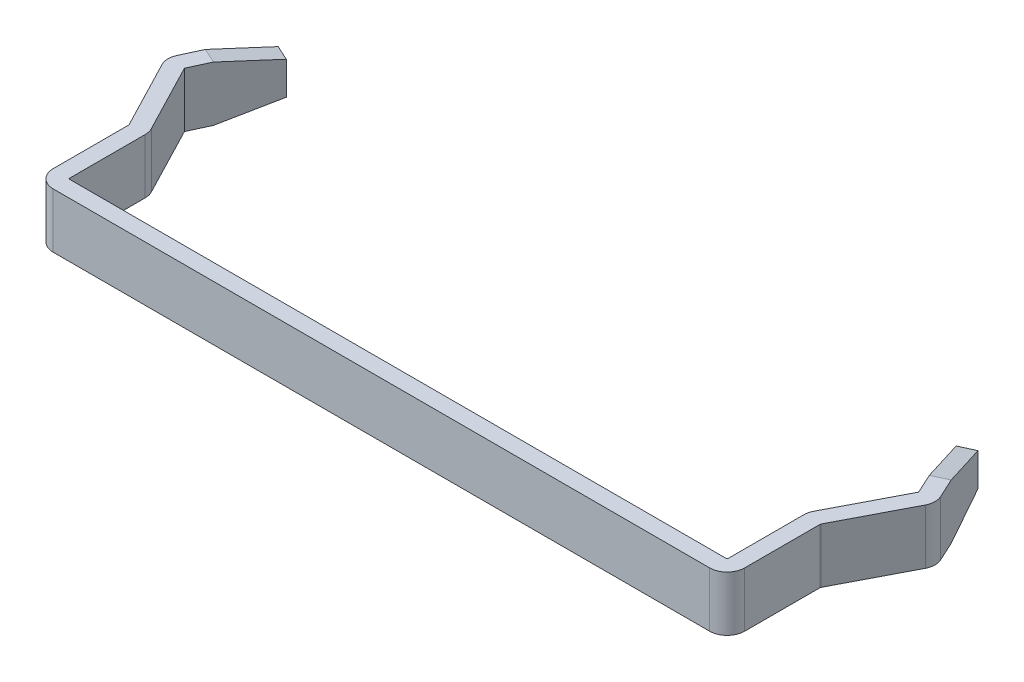
ISO-10303-21;
HEADER;
FILE_DESCRIPTION(('STEP AP214'),'2;1');
FILE_NAME('part.step','',(''),(''),'','','');
FILE_SCHEMA(('AUTOMOTIVE_DESIGN { 1 0 10303 214 1 1 1 1 }'));
ENDSEC;
DATA;
#1=APPLICATION_CONTEXT('core data for automotive mechanical design processes');
#2=APPLICATION_PROTOCOL_DEFINITION('international standard','automotive_design',2000,#1);
#3=PRODUCT_CONTEXT('',#1,'mechanical');
#4=PRODUCT('Part','Part','',(#3));
#5=PRODUCT_RELATED_PRODUCT_CATEGORY('part','',(#4));
#6=PRODUCT_DEFINITION_FORMATION('','',#4);
#7=PRODUCT_DEFINITION_CONTEXT('part definition',#1,'design');
#8=PRODUCT_DEFINITION('design','',#6,#7);
#9=PRODUCT_DEFINITION_SHAPE('','',#8);
#10=(LENGTH_UNIT() NAMED_UNIT(*) SI_UNIT(.MILLI.,.METRE.));
#11=(NAMED_UNIT(*) PLANE_ANGLE_UNIT() SI_UNIT($,.RADIAN.));
#12=(NAMED_UNIT(*) SI_UNIT($,.STERADIAN.) SOLID_ANGLE_UNIT());
#13=UNCERTAINTY_MEASURE_WITH_UNIT(LENGTH_MEASURE(1.E-05),#10,'distance_accuracy_value','');
#14=(GEOMETRIC_REPRESENTATION_CONTEXT(3) GLOBAL_UNCERTAINTY_ASSIGNED_CONTEXT((#13)) GLOBAL_UNIT_ASSIGNED_CONTEXT((#10,
#11,#12)) REPRESENTATION_CONTEXT('',''));
#15=CARTESIAN_POINT('',(0.,0.,0.));
#16=DIRECTION('',(0.,0.,1.));
#17=DIRECTION('',(1.,0.,0.));
#18=AXIS2_PLACEMENT_3D('',#15,#16,#17);
#19=CARTESIAN_POINT('',(6.239242818792,2.5,-3.432167207178));
#20=DIRECTION('',(0.419114229203929,0.,0.907933512366845));
#21=DIRECTION('',(0.907933512366845,0.,-0.419114229203929));
#22=AXIS2_PLACEMENT_3D('',#19,#20,#21);
#23=PLANE('',#22);
#24=DIRECTION('',(0.907933512367032,1.02637805662003E-13,-0.419114229203525));
#25=VECTOR('',#24,1.);
#26=CARTESIAN_POINT('',(6.103052791937,2.80000000000007,-3.36930007279701));
#27=LINE('',#26,#25);
#28=CARTESIAN_POINT('',(6.103052791937,2.80000000000007,-3.36930007279701));
#29=VERTEX_POINT('',#28);
#30=CARTESIAN_POINT('',(6.375432845647,2.80000000000003,-3.49503434155801));
#31=VERTEX_POINT('',#30);
#32=EDGE_CURVE('E248',#29,#31,#27,.T.);
#33=ORIENTED_EDGE('',*,*,#32,.T.);
#34=DIRECTION('',(0.,1.,0.));
#35=VECTOR('',#34,1.);
#36=CARTESIAN_POINT('',(6.375432845647,2.,-3.495034341558));
#37=LINE('',#36,#35);
#38=CARTESIAN_POINT('',(6.375432845647,2.19999999999997,-3.49503434155801));
#39=VERTEX_POINT('',#38);
#40=EDGE_CURVE('E235',#31,#39,#37,.F.);
#41=ORIENTED_EDGE('',*,*,#40,.T.);
#42=DIRECTION('',(-0.907933512367032,1.02637805662003E-13,0.419114229203525));
#43=VECTOR('',#42,1.);
#44=CARTESIAN_POINT('',(6.37543284564699,2.1999999999999,-3.49503434155802));
#45=LINE('',#44,#43);
#46=CARTESIAN_POINT('',(6.103052791937,2.19999999999998,-3.369300072797));
#47=VERTEX_POINT('',#46);
#48=EDGE_CURVE('E230',#39,#47,#45,.T.);
#49=ORIENTED_EDGE('',*,*,#48,.T.);
#50=DIRECTION('',(0.,1.,0.));
#51=VECTOR('',#50,1.);
#52=CARTESIAN_POINT('',(6.103052791937,3.,-3.369300072797));
#53=LINE('',#52,#51);
#54=EDGE_CURVE('E232',#47,#29,#53,.T.);
#55=ORIENTED_EDGE('',*,*,#54,.T.);
#56=EDGE_LOOP('',(#33,#41,#49,#55));
#57=FACE_BOUND('',#56,.T.);
#58=ADVANCED_FACE('F17',(#57),#23,.F.);
#59=CARTESIAN_POINT('',(-6.239242818792,2.5,-3.432167207178));
#60=DIRECTION('',(0.419114229203929,0.,-0.907933512366845));
#61=DIRECTION('',(-0.907933512366845,0.,-0.419114229203929));
#62=AXIS2_PLACEMENT_3D('',#59,#60,#61);
#63=PLANE('',#62);
#64=DIRECTION('',(0.,1.,0.));
#65=VECTOR('',#64,1.);
#66=CARTESIAN_POINT('',(-6.10305279193781,3.,-3.36930007279737));
#67=LINE('',#66,#65);
#68=CARTESIAN_POINT('',(-6.10305279193785,2.79999999999959,-3.3693000727973));
#69=VERTEX_POINT('',#68);
#70=CARTESIAN_POINT('',(-6.10305279193785,2.20000000000044,-3.3693000727973));
#71=VERTEX_POINT('',#70);
#72=EDGE_CURVE('E279',#69,#71,#67,.F.);
#73=ORIENTED_EDGE('',*,*,#72,.T.);
#74=DIRECTION('',(0.907933512367031,1.02637805662004E-13,0.419114229203526));
#75=VECTOR('',#74,1.);
#76=CARTESIAN_POINT('',(-6.37543284564711,2.20000000000128,-3.49503434155777));
#77=LINE('',#76,#75);
#78=CARTESIAN_POINT('',(-6.37543284564783,2.20000000000043,-3.49503434155829));
#79=VERTEX_POINT('',#78);
#80=EDGE_CURVE('E239',#79,#71,#77,.T.);
#81=ORIENTED_EDGE('',*,*,#80,.F.);
#82=DIRECTION('',(0.,1.,0.));
#83=VECTOR('',#82,1.);
#84=CARTESIAN_POINT('',(-6.37543284564819,2.,-3.49503434155855));
#85=LINE('',#84,#83);
#86=CARTESIAN_POINT('',(-6.37543284564747,2.7999999999988,-3.49503434155804));
#87=VERTEX_POINT('',#86);
#88=EDGE_CURVE('E276',#79,#87,#85,.T.);
#89=ORIENTED_EDGE('',*,*,#88,.T.);
#90=DIRECTION('',(-0.907933512367032,1.04083408558651E-13,-0.419114229203524));
#91=VECTOR('',#90,1.);
#92=CARTESIAN_POINT('',(-6.10305279193711,2.79999999999877,-3.36930007279678));
#93=LINE('',#92,#91);
#94=EDGE_CURVE('E197',#69,#87,#93,.T.);
#95=ORIENTED_EDGE('',*,*,#94,.F.);
#96=EDGE_LOOP('',(#73,#81,#89,#95));
#97=FACE_BOUND('',#96,.T.);
#98=ADVANCED_FACE('F572',(#97),#63,.T.);
#99=CARTESIAN_POINT('',(6.239242818792,2.2,-3.432167207178));
#100=DIRECTION('',(0.0821950628129803,0.980580675690884,0.178060411407979));
#101=DIRECTION('',(0.,-0.178664967028473,0.983909970249674));
#102=AXIS2_PLACEMENT_3D('',#99,#100,#101);
#103=PLANE('',#102);
#104=DIRECTION('',(-0.907933512365772,0.,0.419114229206253));
#105=VECTOR('',#104,1.);
#106=CARTESIAN_POINT('',(6.794547074852,2.,-2.587100829192));
#107=LINE('',#106,#105);
#108=CARTESIAN_POINT('',(6.7945470748516,2.,-2.58710082919181));
#109=VERTEX_POINT('',#108);
#110=CARTESIAN_POINT('',(6.52216702114173,2.,-2.46136656042987));
#111=VERTEX_POINT('',#110);
#112=EDGE_CURVE('E253',#109,#111,#107,.T.);
#113=ORIENTED_EDGE('',*,*,#112,.T.);
#114=DIRECTION('',(-0.410975314064477,0.196116135138073,-0.890302057039132));
#115=VECTOR('',#114,1.);
#116=CARTESIAN_POINT('',(6.52216702114118,2.,-2.46136656042962));
#117=LINE('',#116,#115);
#118=EDGE_CURVE('E244',#111,#47,#117,.T.);
#119=ORIENTED_EDGE('',*,*,#118,.T.);
#120=ORIENTED_EDGE('',*,*,#48,.F.);
#121=DIRECTION('',(0.410975314064463,-0.196116135138244,0.890302057039101));
#122=VECTOR('',#121,1.);
#123=CARTESIAN_POINT('',(6.375432845647,2.2,-3.495034341558));
#124=LINE('',#123,#122);
#125=EDGE_CURVE('E269',#39,#109,#124,.T.);
#126=ORIENTED_EDGE('',*,*,#125,.T.);
#127=EDGE_LOOP('',(#113,#119,#120,#126));
#128=FACE_BOUND('',#127,.T.);
#129=ADVANCED_FACE('F251',(#128),#103,.F.);
#130=CARTESIAN_POINT('',(3.539853882907,2.,2.183396605594));
#131=DIRECTION('',(0.0821950628129803,-0.980580675690884,-0.178060411407979));
#132=DIRECTION('',(0.,0.178664967028473,-0.983909970249674));
#133=AXIS2_PLACEMENT_3D('',#130,#131,#132);
#134=PLANE('',#133);
#135=DIRECTION('',(-0.410975314064477,-0.196116135138073,0.890302057039132));
#136=VECTOR('',#135,1.);
#137=CARTESIAN_POINT('',(-6.10305279193781,2.2,-3.36930007279737));
#138=LINE('',#137,#136);
#139=CARTESIAN_POINT('',(-6.522167021142,1.99999999999999,-2.46136656043));
#140=VERTEX_POINT('',#139);
#141=EDGE_CURVE('E410',#71,#140,#138,.T.);
#142=ORIENTED_EDGE('',*,*,#141,.T.);
#143=DIRECTION('',(-0.907933512365773,0.,-0.419114229206252));
#144=VECTOR('',#143,1.);
#145=CARTESIAN_POINT('',(-6.522167021142,1.99999999999998,-2.46136656043));
#146=LINE('',#145,#144);
#147=CARTESIAN_POINT('',(-6.794547074852,1.99999999999999,-2.587100829192));
#148=VERTEX_POINT('',#147);
#149=EDGE_CURVE('E473',#140,#148,#146,.T.);
#150=ORIENTED_EDGE('',*,*,#149,.T.);
#151=DIRECTION('',(0.410975314064462,0.196116135138244,-0.890302057039101));
#152=VECTOR('',#151,1.);
#153=CARTESIAN_POINT('',(-6.79454707485199,2.,-2.58710082919199));
#154=LINE('',#153,#152);
#155=EDGE_CURVE('E290',#148,#79,#154,.T.);
#156=ORIENTED_EDGE('',*,*,#155,.T.);
#157=ORIENTED_EDGE('',*,*,#80,.T.);
#158=EDGE_LOOP('',(#142,#150,#156,#157));
#159=FACE_BOUND('',#158,.T.);
#160=ADVANCED_FACE('F481',(#159),#134,.T.);
#161=CARTESIAN_POINT('',(-6.68,0.,-2.1));
#162=DIRECTION('',(0.,1.,0.));
#163=DIRECTION('',(0.,0.,1.));
#164=AXIS2_PLACEMENT_3D('',#161,#162,#163);
#165=CYLINDRICAL_SURFACE('',#164,0.008152016572859);
#166=CARTESIAN_POINT('',(-6.68,3.,-2.1));
#167=DIRECTION('',(0.,1.,0.));
#168=DIRECTION('',(0.,0.,1.));
#169=AXIS2_PLACEMENT_3D('',#166,#167,#168);
#170=CIRCLE('',#169,0.008152016572859);
#171=CARTESIAN_POINT('',(-6.68740148903991,2.99999999999999,-2.10341662614219));
#172=VERTEX_POINT('',#171);
#173=CARTESIAN_POINT('',(-6.687234125005,3.,-2.09624196732115));
#174=VERTEX_POINT('',#173);
#175=EDGE_CURVE('E352',#172,#174,#170,.T.);
#176=ORIENTED_EDGE('',*,*,#175,.T.);
#177=DIRECTION('',(0.,1.,0.));
#178=VECTOR('',#177,1.);
#179=CARTESIAN_POINT('',(-6.68723412500487,3.,-2.09624196732107));
#180=LINE('',#179,#178);
#181=CARTESIAN_POINT('',(-6.687234125005,2.,-2.09624196732115));
#182=VERTEX_POINT('',#181);
#183=EDGE_CURVE('E286',#174,#182,#180,.F.);
#184=ORIENTED_EDGE('',*,*,#183,.T.);
#185=CARTESIAN_POINT('',(-6.68,2.,-2.1));
#186=DIRECTION('',(0.,1.,0.));
#187=DIRECTION('',(0.,0.,1.));
#188=AXIS2_PLACEMENT_3D('',#185,#186,#187);
#189=CIRCLE('',#188,0.008152016572859);
#190=CARTESIAN_POINT('',(-6.68740148903991,1.99999999999999,-2.10341662614219));
#191=VERTEX_POINT('',#190);
#192=EDGE_CURVE('E360',#182,#191,#189,.F.);
#193=ORIENTED_EDGE('',*,*,#192,.T.);
#194=DIRECTION('',(0.,1.,0.));
#195=VECTOR('',#194,1.);
#196=CARTESIAN_POINT('',(-6.68740148904,3.,-2.103416626142));
#197=LINE('',#196,#195);
#198=EDGE_CURVE('E407',#191,#172,#197,.T.);
#199=ORIENTED_EDGE('',*,*,#198,.T.);
#200=EDGE_LOOP('',(#176,#184,#193,#199));
#201=FACE_BOUND('',#200,.T.);
#202=ADVANCED_FACE('F586',(#201),#165,.F.);
#203=CARTESIAN_POINT('',(-6.036030999085,3.,-0.842691181759));
#204=DIRECTION('',(-0.887403127858645,0.,0.460994239298816));
#205=DIRECTION('',(0.460994239298816,0.,0.887403127858645));
#206=AXIS2_PLACEMENT_3D('',#203,#204,#205);
#207=PLANE('',#206);
#208=DIRECTION('',(0.460994239298908,0.,0.887403127858597));
#209=VECTOR('',#208,1.);
#210=CARTESIAN_POINT('',(-6.687234125005,2.99999999999998,-2.096241967321));
#211=LINE('',#210,#209);
#212=CARTESIAN_POINT('',(-6.03603099908518,3.,-0.842691181759056));
#213=VERTEX_POINT('',#212);
#214=EDGE_CURVE('E351',#174,#213,#211,.T.);
#215=ORIENTED_EDGE('',*,*,#214,.T.);
#216=DIRECTION('',(0.,-1.,0.));
#217=VECTOR('',#216,1.);
#218=CARTESIAN_POINT('',(-6.03603099908524,0.,-0.842691181758876));
#219=LINE('',#218,#217);
#220=CARTESIAN_POINT('',(-6.03603099908518,2.,-0.842691181759056));
#221=VERTEX_POINT('',#220);
#222=EDGE_CURVE('E464',#221,#213,#219,.F.);
#223=ORIENTED_EDGE('',*,*,#222,.F.);
#224=DIRECTION('',(-0.460994239298909,0.,-0.887403127858596));
#225=VECTOR('',#224,1.);
#226=CARTESIAN_POINT('',(-6.036030999085,1.99999999999998,-0.842691181759));
#227=LINE('',#226,#225);
#228=EDGE_CURVE('E364',#221,#182,#227,.T.);
#229=ORIENTED_EDGE('',*,*,#228,.T.);
#230=ORIENTED_EDGE('',*,*,#183,.F.);
#231=EDGE_LOOP('',(#215,#223,#229,#230));
#232=FACE_BOUND('',#231,.T.);
#233=ADVANCED_FACE('F590',(#232),#207,.F.);
#234=CARTESIAN_POINT('',(-6.320000000001,0.,-0.695173025183));
#235=DIRECTION('',(0.,-1.,0.));
#236=DIRECTION('',(0.,0.,-1.));
#237=AXIS2_PLACEMENT_3D('',#234,#235,#236);
#238=CYLINDRICAL_SURFACE('',#237,0.320000000001);
#239=DIRECTION('',(0.,1.,0.));
#240=VECTOR('',#239,1.);
#241=CARTESIAN_POINT('',(-6.,3.,-0.695173025183));
#242=LINE('',#241,#240);
#243=CARTESIAN_POINT('',(-6.,2.99999999999999,-0.695173025183));
#244=VERTEX_POINT('',#243);
#245=CARTESIAN_POINT('',(-6.,1.99999999999999,-0.695173025183));
#246=VERTEX_POINT('',#245);
#247=EDGE_CURVE('E281',#244,#246,#242,.F.);
#248=ORIENTED_EDGE('',*,*,#247,.T.);
#249=CARTESIAN_POINT('',(-6.320000000001,2.,-0.695173025183));
#250=DIRECTION('',(0.,-1.,0.));
#251=DIRECTION('',(0.,0.,-1.));
#252=AXIS2_PLACEMENT_3D('',#249,#250,#251);
#253=CIRCLE('',#252,0.320000000001);
#254=EDGE_CURVE('E365',#246,#221,#253,.F.);
#255=ORIENTED_EDGE('',*,*,#254,.T.);
#256=ORIENTED_EDGE('',*,*,#222,.T.);
#257=CARTESIAN_POINT('',(-6.320000000001,3.,-0.695173025183));
#258=DIRECTION('',(0.,-1.,0.));
#259=DIRECTION('',(0.,0.,-1.));
#260=AXIS2_PLACEMENT_3D('',#257,#258,#259);
#261=CIRCLE('',#260,0.320000000001);
#262=EDGE_CURVE('E348',#213,#244,#261,.T.);
#263=ORIENTED_EDGE('',*,*,#262,.T.);
#264=EDGE_LOOP('',(#248,#255,#256,#263));
#265=FACE_BOUND('',#264,.T.);
#266=ADVANCED_FACE('F592',(#265),#238,.T.);
#267=CARTESIAN_POINT('',(6.,3.,-0.695173025183));
#268=DIRECTION('',(1.,0.,0.));
#269=DIRECTION('',(0.,0.,-1.));
#270=AXIS2_PLACEMENT_3D('',#267,#268,#269);
#271=PLANE('',#270);
#272=DIRECTION('',(0.,0.,1.));
#273=VECTOR('',#272,1.);
#274=CARTESIAN_POINT('',(6.,3.,-3.495034341558));
#275=LINE('',#274,#273);
#276=CARTESIAN_POINT('',(6.,3.,0.68));
#277=VERTEX_POINT('',#276);
#278=CARTESIAN_POINT('',(6.,3.,-0.695173025183));
#279=VERTEX_POINT('',#278);
#280=EDGE_CURVE('E343',#277,#279,#275,.F.);
#281=ORIENTED_EDGE('',*,*,#280,.T.);
#282=DIRECTION('',(0.,-1.,0.));
#283=VECTOR('',#282,1.);
#284=CARTESIAN_POINT('',(6.,0.,-0.695173025183));
#285=LINE('',#284,#283);
#286=CARTESIAN_POINT('',(6.,2.,-0.695173025183));
#287=VERTEX_POINT('',#286);
#288=EDGE_CURVE('E462',#287,#279,#285,.F.);
#289=ORIENTED_EDGE('',*,*,#288,.F.);
#290=DIRECTION('',(0.,0.,1.));
#291=VECTOR('',#290,1.);
#292=CARTESIAN_POINT('',(6.,2.,-3.369300072797));
#293=LINE('',#292,#291);
#294=CARTESIAN_POINT('',(6.,2.,0.68));
#295=VERTEX_POINT('',#294);
#296=EDGE_CURVE('E372',#287,#295,#293,.T.);
#297=ORIENTED_EDGE('',*,*,#296,.T.);
#298=DIRECTION('',(0.,1.,0.));
#299=VECTOR('',#298,1.);
#300=CARTESIAN_POINT('',(6.,0.,0.68));
#301=LINE('',#300,#299);
#302=EDGE_CURVE('E355',#295,#277,#301,.T.);
#303=ORIENTED_EDGE('',*,*,#302,.T.);
#304=EDGE_LOOP('',(#281,#289,#297,#303));
#305=FACE_BOUND('',#304,.T.);
#306=ADVANCED_FACE('F608',(#305),#271,.F.);
#307=CARTESIAN_POINT('',(6.320000000001,0.,-0.695173025183));
#308=DIRECTION('',(0.,-1.,0.));
#309=DIRECTION('',(0.,0.,-1.));
#310=AXIS2_PLACEMENT_3D('',#307,#308,#309);
#311=CYLINDRICAL_SURFACE('',#310,0.320000000001);
#312=DIRECTION('',(0.,1.,0.));
#313=VECTOR('',#312,1.);
#314=CARTESIAN_POINT('',(6.03603099908513,3.,-0.842691181758931));
#315=LINE('',#314,#313);
#316=CARTESIAN_POINT('',(6.03603099908513,3.,-0.842691181759084));
#317=VERTEX_POINT('',#316);
#318=CARTESIAN_POINT('',(6.03603099908513,2.,-0.842691181759084));
#319=VERTEX_POINT('',#318);
#320=EDGE_CURVE('E460',#317,#319,#315,.F.);
#321=ORIENTED_EDGE('',*,*,#320,.T.);
#322=CARTESIAN_POINT('',(6.320000000001,2.,-0.695173025183));
#323=DIRECTION('',(0.,-1.,0.));
#324=DIRECTION('',(0.,0.,-1.));
#325=AXIS2_PLACEMENT_3D('',#322,#323,#324);
#326=CIRCLE('',#325,0.320000000001);
#327=EDGE_CURVE('E369',#319,#287,#326,.F.);
#328=ORIENTED_EDGE('',*,*,#327,.T.);
#329=ORIENTED_EDGE('',*,*,#288,.T.);
#330=CARTESIAN_POINT('',(6.320000000001,3.,-0.695173025183));
#331=DIRECTION('',(0.,-1.,0.));
#332=DIRECTION('',(0.,0.,-1.));
#333=AXIS2_PLACEMENT_3D('',#330,#331,#332);
#334=CIRCLE('',#333,0.320000000001);
#335=EDGE_CURVE('E340',#279,#317,#334,.T.);
#336=ORIENTED_EDGE('',*,*,#335,.T.);
#337=EDGE_LOOP('',(#321,#328,#329,#336));
#338=FACE_BOUND('',#337,.T.);
#339=ADVANCED_FACE('F613',(#338),#311,.T.);
#340=CARTESIAN_POINT('',(6.687234125005,3.,-2.096241967321));
#341=DIRECTION('',(0.887403127858645,0.,0.460994239298816));
#342=DIRECTION('',(0.460994239298816,0.,-0.887403127858645));
#343=AXIS2_PLACEMENT_3D('',#340,#341,#342);
#344=PLANE('',#343);
#345=DIRECTION('',(0.460994239298909,0.,-0.887403127858596));
#346=VECTOR('',#345,1.);
#347=CARTESIAN_POINT('',(6.036030999085,3.,-0.842691181759));
#348=LINE('',#347,#346);
#349=CARTESIAN_POINT('',(6.68723412500506,3.,-2.09624196732112));
#350=VERTEX_POINT('',#349);
#351=EDGE_CURVE('E339',#317,#350,#348,.T.);
#352=ORIENTED_EDGE('',*,*,#351,.T.);
#353=DIRECTION('',(0.,1.,0.));
#354=VECTOR('',#353,1.);
#355=CARTESIAN_POINT('',(6.687234125005,0.,-2.096241967321));
#356=LINE('',#355,#354);
#357=CARTESIAN_POINT('',(6.68723412500506,2.,-2.09624196732112));
#358=VERTEX_POINT('',#357);
#359=EDGE_CURVE('E256',#350,#358,#356,.F.);
#360=ORIENTED_EDGE('',*,*,#359,.T.);
#361=DIRECTION('',(-0.460994239298909,0.,0.887403127858596));
#362=VECTOR('',#361,1.);
#363=CARTESIAN_POINT('',(6.687234125005,2.,-2.096241967321));
#364=LINE('',#363,#362);
#365=EDGE_CURVE('E373',#358,#319,#364,.T.);
#366=ORIENTED_EDGE('',*,*,#365,.T.);
#367=ORIENTED_EDGE('',*,*,#320,.F.);
#368=EDGE_LOOP('',(#352,#360,#366,#367));
#369=FACE_BOUND('',#368,.T.);
#370=ADVANCED_FACE('F618',(#369),#344,.F.);
#371=CARTESIAN_POINT('',(6.68,0.,-2.1));
#372=DIRECTION('',(0.,1.,0.));
#373=DIRECTION('',(0.,0.,1.));
#374=AXIS2_PLACEMENT_3D('',#371,#372,#373);
#375=CYLINDRICAL_SURFACE('',#374,0.008152016572872);
#376=CARTESIAN_POINT('',(6.68,3.,-2.1));
#377=DIRECTION('',(0.,1.,0.));
#378=DIRECTION('',(0.,0.,1.));
#379=AXIS2_PLACEMENT_3D('',#376,#377,#378);
#380=CIRCLE('',#379,0.008152016572872);
#381=CARTESIAN_POINT('',(6.68740148903951,3.,-2.103416626142));
#382=VERTEX_POINT('',#381);
#383=EDGE_CURVE('E335',#350,#382,#380,.T.);
#384=ORIENTED_EDGE('',*,*,#383,.T.);
#385=DIRECTION('',(0.,1.,0.));
#386=VECTOR('',#385,1.);
#387=CARTESIAN_POINT('',(6.68740148903919,3.,-2.10341662614163));
#388=LINE('',#387,#386);
#389=CARTESIAN_POINT('',(6.68740148903951,2.,-2.103416626142));
#390=VERTEX_POINT('',#389);
#391=EDGE_CURVE('E254',#382,#390,#388,.F.);
#392=ORIENTED_EDGE('',*,*,#391,.T.);
#393=CARTESIAN_POINT('',(6.68,2.,-2.1));
#394=DIRECTION('',(0.,1.,0.));
#395=DIRECTION('',(0.,0.,1.));
#396=AXIS2_PLACEMENT_3D('',#393,#394,#395);
#397=CIRCLE('',#396,0.008152016572872);
#398=EDGE_CURVE('E374',#390,#358,#397,.F.);
#399=ORIENTED_EDGE('',*,*,#398,.T.);
#400=ORIENTED_EDGE('',*,*,#359,.F.);
#401=EDGE_LOOP('',(#384,#392,#399,#400));
#402=FACE_BOUND('',#401,.T.);
#403=ADVANCED_FACE('F620',(#402),#375,.F.);
#404=CARTESIAN_POINT('',(6.103052791937,3.,-3.369300072797));
#405=DIRECTION('',(0.907933512366845,0.,-0.419114229203929));
#406=DIRECTION('',(-0.419114229203929,0.,-0.907933512366845));
#407=AXIS2_PLACEMENT_3D('',#404,#405,#406);
#408=PLANE('',#407);
#409=DIRECTION('',(-0.410975314065261,-0.196116135138363,-0.890302057038706));
#410=VECTOR('',#409,1.);
#411=CARTESIAN_POINT('',(6.52216702114197,3.00000000000037,-2.46136656043007));
#412=LINE('',#411,#410);
#413=CARTESIAN_POINT('',(6.52216702114199,3.00000000000012,-2.46136656043002));
#414=VERTEX_POINT('',#413);
#415=EDGE_CURVE('E247',#414,#29,#412,.T.);
#416=ORIENTED_EDGE('',*,*,#415,.T.);
#417=ORIENTED_EDGE('',*,*,#54,.F.);
#418=ORIENTED_EDGE('',*,*,#118,.F.);
#419=DIRECTION('',(0.419114229203896,0.,0.90793351236686));
#420=VECTOR('',#419,1.);
#421=CARTESIAN_POINT('',(6.522167021142,2.,-2.46136656043));
#422=LINE('',#421,#420);
#423=EDGE_CURVE('E265',#111,#390,#422,.T.);
#424=ORIENTED_EDGE('',*,*,#423,.T.);
#425=ORIENTED_EDGE('',*,*,#391,.F.);
#426=DIRECTION('',(-0.419114229203896,0.,-0.90793351236686));
#427=VECTOR('',#426,1.);
#428=CARTESIAN_POINT('',(6.68740148904,3.,-2.103416626142));
#429=LINE('',#428,#427);
#430=EDGE_CURVE('E338',#382,#414,#429,.T.);
#431=ORIENTED_EDGE('',*,*,#430,.T.);
#432=EDGE_LOOP('',(#416,#417,#418,#424,#425,#431));
#433=FACE_BOUND('',#432,.T.);
#434=ADVANCED_FACE('F242',(#433),#408,.F.);
#435=CARTESIAN_POINT('',(6.239242818792,2.8,-3.432167207178));
#436=DIRECTION('',(0.0821950628129803,-0.980580675690884,0.178060411407979));
#437=DIRECTION('',(0.,-0.178664967028473,-0.983909970249674));
#438=AXIS2_PLACEMENT_3D('',#435,#436,#437);
#439=PLANE('',#438);
#440=DIRECTION('',(0.907933512365772,0.,-0.419114229206253));
#441=VECTOR('',#440,1.);
#442=CARTESIAN_POINT('',(6.522167021142,3.,-2.46136656043));
#443=LINE('',#442,#441);
#444=CARTESIAN_POINT('',(6.7945470748516,3.,-2.58710082919181));
#445=VERTEX_POINT('',#444);
#446=EDGE_CURVE('E451',#414,#445,#443,.T.);
#447=ORIENTED_EDGE('',*,*,#446,.T.);
#448=DIRECTION('',(-0.410975314064463,-0.196116135138244,-0.890302057039101));
#449=VECTOR('',#448,1.);
#450=CARTESIAN_POINT('',(6.7945470748508,3.,-2.58710082919144));
#451=LINE('',#450,#449);
#452=EDGE_CURVE('E271',#445,#31,#451,.T.);
#453=ORIENTED_EDGE('',*,*,#452,.T.);
#454=ORIENTED_EDGE('',*,*,#32,.F.);
#455=ORIENTED_EDGE('',*,*,#415,.F.);
#456=EDGE_LOOP('',(#447,#453,#454,#455));
#457=FACE_BOUND('',#456,.T.);
#458=ADVANCED_FACE('F819',(#457),#439,.F.);
#459=CARTESIAN_POINT('',(6.375432845647,2.,-3.495034341558));
#460=DIRECTION('',(-0.907933512366845,0.,0.419114229203929));
#461=DIRECTION('',(0.419114229203929,0.,0.907933512366845));
#462=AXIS2_PLACEMENT_3D('',#459,#460,#461);
#463=PLANE('',#462);
#464=ORIENTED_EDGE('',*,*,#452,.F.);
#465=DIRECTION('',(0.419114229203896,0.,0.90793351236686));
#466=VECTOR('',#465,1.);
#467=CARTESIAN_POINT('',(6.794547074852,3.,-2.587100829192));
#468=LINE('',#467,#466);
#469=CARTESIAN_POINT('',(6.95978154275003,3.,-2.22915089490381));
#470=VERTEX_POINT('',#469);
#471=EDGE_CURVE('E334',#445,#470,#468,.T.);
#472=ORIENTED_EDGE('',*,*,#471,.T.);
#473=DIRECTION('',(0.,1.,0.));
#474=VECTOR('',#473,1.);
#475=CARTESIAN_POINT('',(6.9597815427499,0.,-2.22915089490395));
#476=LINE('',#475,#474);
#477=CARTESIAN_POINT('',(6.95978154275003,2.,-2.22915089490381));
#478=VERTEX_POINT('',#477);
#479=EDGE_CURVE('E297',#478,#470,#476,.T.);
#480=ORIENTED_EDGE('',*,*,#479,.F.);
#481=DIRECTION('',(-0.419114229203896,0.,-0.90793351236686));
#482=VECTOR('',#481,1.);
#483=CARTESIAN_POINT('',(6.95978154275,2.,-2.229150894904));
#484=LINE('',#483,#482);
#485=EDGE_CURVE('E266',#478,#109,#484,.T.);
#486=ORIENTED_EDGE('',*,*,#485,.T.);
#487=ORIENTED_EDGE('',*,*,#125,.F.);
#488=ORIENTED_EDGE('',*,*,#40,.F.);
#489=EDGE_LOOP('',(#464,#472,#480,#486,#487,#488));
#490=FACE_BOUND('',#489,.T.);
#491=ADVANCED_FACE('F627',(#490),#463,.F.);
#492=CARTESIAN_POINT('',(6.68,0.,-2.1));
#493=DIRECTION('',(0.,1.,0.));
#494=DIRECTION('',(0.,0.,1.));
#495=AXIS2_PLACEMENT_3D('',#492,#493,#494);
#496=CYLINDRICAL_SURFACE('',#495,0.308152016573);
#497=CARTESIAN_POINT('',(6.68,3.,-2.1));
#498=DIRECTION('',(0.,1.,0.));
#499=DIRECTION('',(0.,0.,1.));
#500=AXIS2_PLACEMENT_3D('',#497,#498,#499);
#501=CIRCLE('',#500,0.308152016573);
#502=CARTESIAN_POINT('',(6.95345506336288,3.,-1.95794369553177));
#503=VERTEX_POINT('',#502);
#504=EDGE_CURVE('E331',#470,#503,#501,.F.);
#505=ORIENTED_EDGE('',*,*,#504,.T.);
#506=DIRECTION('',(0.,1.,0.));
#507=VECTOR('',#506,1.);
#508=CARTESIAN_POINT('',(6.953455063363,2.,-1.957943695532));
#509=LINE('',#508,#507);
#510=CARTESIAN_POINT('',(6.95345506336288,2.,-1.95794369553177));
#511=VERTEX_POINT('',#510);
#512=EDGE_CURVE('E444',#503,#511,#509,.F.);
#513=ORIENTED_EDGE('',*,*,#512,.T.);
#514=CARTESIAN_POINT('',(6.68,2.,-2.1));
#515=DIRECTION('',(0.,1.,0.));
#516=DIRECTION('',(0.,0.,1.));
#517=AXIS2_PLACEMENT_3D('',#514,#515,#516);
#518=CIRCLE('',#517,0.308152016573);
#519=EDGE_CURVE('E377',#511,#478,#518,.T.);
#520=ORIENTED_EDGE('',*,*,#519,.T.);
#521=ORIENTED_EDGE('',*,*,#479,.T.);
#522=EDGE_LOOP('',(#505,#513,#520,#521));
#523=FACE_BOUND('',#522,.T.);
#524=ADVANCED_FACE('F630',(#523),#496,.T.);
#525=CARTESIAN_POINT('',(6.953455063363,2.,-1.957943695532));
#526=DIRECTION('',(-0.887403127858645,0.,-0.460994239298816));
#527=DIRECTION('',(-0.460994239298816,0.,0.887403127858645));
#528=AXIS2_PLACEMENT_3D('',#525,#526,#527);
#529=PLANE('',#528);
#530=ORIENTED_EDGE('',*,*,#512,.F.);
#531=DIRECTION('',(-0.460994239298909,0.,0.887403127858597));
#532=VECTOR('',#531,1.);
#533=CARTESIAN_POINT('',(6.953455063363,3.,-1.957943695532));
#534=LINE('',#533,#532);
#535=CARTESIAN_POINT('',(6.30225193744308,3.,-0.704392909969662));
#536=VERTEX_POINT('',#535);
#537=EDGE_CURVE('E330',#503,#536,#534,.T.);
#538=ORIENTED_EDGE('',*,*,#537,.T.);
#539=DIRECTION('',(0.,-1.,0.));
#540=VECTOR('',#539,1.);
#541=CARTESIAN_POINT('',(6.3022519374434,0.,-0.70439290996979));
#542=LINE('',#541,#540);
#543=CARTESIAN_POINT('',(6.30225193744308,2.,-0.704392909969662));
#544=VERTEX_POINT('',#543);
#545=EDGE_CURVE('E442',#536,#544,#542,.T.);
#546=ORIENTED_EDGE('',*,*,#545,.T.);
#547=DIRECTION('',(0.460994239298909,0.,-0.887403127858597));
#548=VECTOR('',#547,1.);
#549=CARTESIAN_POINT('',(6.302251937443,2.,-0.70439290997));
#550=LINE('',#549,#548);
#551=EDGE_CURVE('E380',#544,#511,#550,.T.);
#552=ORIENTED_EDGE('',*,*,#551,.T.);
#553=EDGE_LOOP('',(#530,#538,#546,#552));
#554=FACE_BOUND('',#553,.T.);
#555=ADVANCED_FACE('F635',(#554),#529,.F.);
#556=CARTESIAN_POINT('',(6.320000000001,0.,-0.695173025183));
#557=DIRECTION('',(0.,-1.,0.));
#558=DIRECTION('',(0.,0.,-1.));
#559=AXIS2_PLACEMENT_3D('',#556,#557,#558);
#560=CYLINDRICAL_SURFACE('',#559,0.02000000000075);
#561=ORIENTED_EDGE('',*,*,#545,.F.);
#562=CARTESIAN_POINT('',(6.320000000001,3.,-0.695173025183));
#563=DIRECTION('',(0.,-1.,0.));
#564=DIRECTION('',(0.,0.,-1.));
#565=AXIS2_PLACEMENT_3D('',#562,#563,#564);
#566=CIRCLE('',#565,0.02000000000075);
#567=CARTESIAN_POINT('',(6.3,3.,-0.695173025183));
#568=VERTEX_POINT('',#567);
#569=EDGE_CURVE('E327',#536,#568,#566,.F.);
#570=ORIENTED_EDGE('',*,*,#569,.T.);
#571=DIRECTION('',(0.,1.,0.));
#572=VECTOR('',#571,1.);
#573=CARTESIAN_POINT('',(6.3,2.,-0.695173025183));
#574=LINE('',#573,#572);
#575=CARTESIAN_POINT('',(6.3,2.,-0.695173025183));
#576=VERTEX_POINT('',#575);
#577=EDGE_CURVE('E440',#568,#576,#574,.F.);
#578=ORIENTED_EDGE('',*,*,#577,.T.);
#579=CARTESIAN_POINT('',(6.320000000001,2.,-0.695173025183));
#580=DIRECTION('',(0.,-1.,0.));
#581=DIRECTION('',(0.,0.,-1.));
#582=AXIS2_PLACEMENT_3D('',#579,#580,#581);
#583=CIRCLE('',#582,0.02000000000075);
#584=EDGE_CURVE('E381',#576,#544,#583,.T.);
#585=ORIENTED_EDGE('',*,*,#584,.T.);
#586=EDGE_LOOP('',(#561,#570,#578,#585));
#587=FACE_BOUND('',#586,.T.);
#588=ADVANCED_FACE('F639',(#587),#560,.F.);
#589=CARTESIAN_POINT('',(6.3,2.,-0.695173025183));
#590=DIRECTION('',(-1.,0.,0.));
#591=DIRECTION('',(0.,0.,1.));
#592=AXIS2_PLACEMENT_3D('',#589,#590,#591);
#593=PLANE('',#592);
#594=ORIENTED_EDGE('',*,*,#577,.F.);
#595=DIRECTION('',(0.,0.,1.));
#596=VECTOR('',#595,1.);
#597=CARTESIAN_POINT('',(6.3,3.,-3.495034341558));
#598=LINE('',#597,#596);
#599=CARTESIAN_POINT('',(6.3,3.,0.68));
#600=VERTEX_POINT('',#599);
#601=EDGE_CURVE('E326',#568,#600,#598,.T.);
#602=ORIENTED_EDGE('',*,*,#601,.T.);
#603=DIRECTION('',(0.,1.,0.));
#604=VECTOR('',#603,1.);
#605=CARTESIAN_POINT('',(6.3,0.,0.68));
#606=LINE('',#605,#604);
#607=CARTESIAN_POINT('',(6.3,2.,0.68));
#608=VERTEX_POINT('',#607);
#609=EDGE_CURVE('E438',#608,#600,#606,.T.);
#610=ORIENTED_EDGE('',*,*,#609,.F.);
#611=DIRECTION('',(0.,0.,1.));
#612=VECTOR('',#611,1.);
#613=CARTESIAN_POINT('',(6.3,2.,-3.369300072797));
#614=LINE('',#613,#612);
#615=EDGE_CURVE('E384',#608,#576,#614,.F.);
#616=ORIENTED_EDGE('',*,*,#615,.T.);
#617=EDGE_LOOP('',(#594,#602,#610,#616));
#618=FACE_BOUND('',#617,.T.);
#619=ADVANCED_FACE('F641',(#618),#593,.F.);
#620=CARTESIAN_POINT('',(5.98,0.,0.68));
#621=DIRECTION('',(0.,1.,0.));
#622=DIRECTION('',(0.,0.,1.));
#623=AXIS2_PLACEMENT_3D('',#620,#621,#622);
#624=CYLINDRICAL_SURFACE('',#623,0.32);
#625=CARTESIAN_POINT('',(5.98,3.,0.68));
#626=DIRECTION('',(0.,1.,0.));
#627=DIRECTION('',(0.,0.,1.));
#628=AXIS2_PLACEMENT_3D('',#625,#626,#627);
#629=CIRCLE('',#628,0.32);
#630=CARTESIAN_POINT('',(5.98,3.,1.));
#631=VERTEX_POINT('',#630);
#632=EDGE_CURVE('E323',#600,#631,#629,.F.);
#633=ORIENTED_EDGE('',*,*,#632,.T.);
#634=DIRECTION('',(0.,1.,0.));
#635=VECTOR('',#634,1.);
#636=CARTESIAN_POINT('',(5.98,2.,1.));
#637=LINE('',#636,#635);
#638=CARTESIAN_POINT('',(5.98,2.,1.));
#639=VERTEX_POINT('',#638);
#640=EDGE_CURVE('E436',#631,#639,#637,.F.);
#641=ORIENTED_EDGE('',*,*,#640,.T.);
#642=CARTESIAN_POINT('',(5.98,2.,0.68));
#643=DIRECTION('',(0.,1.,0.));
#644=DIRECTION('',(0.,0.,1.));
#645=AXIS2_PLACEMENT_3D('',#642,#643,#644);
#646=CIRCLE('',#645,0.32);
#647=EDGE_CURVE('E385',#639,#608,#646,.T.);
#648=ORIENTED_EDGE('',*,*,#647,.T.);
#649=ORIENTED_EDGE('',*,*,#609,.T.);
#650=EDGE_LOOP('',(#633,#641,#648,#649));
#651=FACE_BOUND('',#650,.T.);
#652=ADVANCED_FACE('F644',(#651),#624,.T.);
#653=CARTESIAN_POINT('',(5.98,2.,1.));
#654=DIRECTION('',(0.,0.,-1.));
#655=DIRECTION('',(-1.,0.,0.));
#656=AXIS2_PLACEMENT_3D('',#653,#654,#655);
#657=PLANE('',#656);
#658=ORIENTED_EDGE('',*,*,#640,.F.);
#659=DIRECTION('',(1.,0.,0.));
#660=VECTOR('',#659,1.);
#661=CARTESIAN_POINT('',(6.375432845647,3.,1.));
#662=LINE('',#661,#660);
#663=CARTESIAN_POINT('',(-5.98,2.99999999999999,1.));
#664=VERTEX_POINT('',#663);
#665=EDGE_CURVE('E322',#631,#664,#662,.F.);
#666=ORIENTED_EDGE('',*,*,#665,.T.);
#667=DIRECTION('',(0.,1.,0.));
#668=VECTOR('',#667,1.);
#669=CARTESIAN_POINT('',(-5.98,0.,1.));
#670=LINE('',#669,#668);
#671=CARTESIAN_POINT('',(-5.98,1.99999999999999,1.));
#672=VERTEX_POINT('',#671);
#673=EDGE_CURVE('E434',#672,#664,#670,.T.);
#674=ORIENTED_EDGE('',*,*,#673,.F.);
#675=DIRECTION('',(-1.,0.,0.));
#676=VECTOR('',#675,1.);
#677=CARTESIAN_POINT('',(6.103052791937,2.,1.));
#678=LINE('',#677,#676);
#679=EDGE_CURVE('E388',#672,#639,#678,.F.);
#680=ORIENTED_EDGE('',*,*,#679,.T.);
#681=EDGE_LOOP('',(#658,#666,#674,#680));
#682=FACE_BOUND('',#681,.T.);
#683=ADVANCED_FACE('F518',(#682),#657,.F.);
#684=CARTESIAN_POINT('',(-5.98,0.,0.68));
#685=DIRECTION('',(0.,1.,0.));
#686=DIRECTION('',(0.,0.,1.));
#687=AXIS2_PLACEMENT_3D('',#684,#685,#686);
#688=CYLINDRICAL_SURFACE('',#687,0.32);
#689=CARTESIAN_POINT('',(-5.98,3.,0.68));
#690=DIRECTION('',(0.,1.,0.));
#691=DIRECTION('',(0.,0.,1.));
#692=AXIS2_PLACEMENT_3D('',#689,#690,#691);
#693=CIRCLE('',#692,0.32);
#694=CARTESIAN_POINT('',(-6.3,2.99999999999999,0.68));
#695=VERTEX_POINT('',#694);
#696=EDGE_CURVE('E319',#664,#695,#693,.F.);
#697=ORIENTED_EDGE('',*,*,#696,.T.);
#698=DIRECTION('',(0.,1.,0.));
#699=VECTOR('',#698,1.);
#700=CARTESIAN_POINT('',(-6.3,2.,0.68));
#701=LINE('',#700,#699);
#702=CARTESIAN_POINT('',(-6.3,1.99999999999999,0.68));
#703=VERTEX_POINT('',#702);
#704=EDGE_CURVE('E432',#695,#703,#701,.F.);
#705=ORIENTED_EDGE('',*,*,#704,.T.);
#706=CARTESIAN_POINT('',(-5.98,2.,0.68));
#707=DIRECTION('',(0.,1.,0.));
#708=DIRECTION('',(0.,0.,1.));
#709=AXIS2_PLACEMENT_3D('',#706,#707,#708);
#710=CIRCLE('',#709,0.32);
#711=EDGE_CURVE('E389',#703,#672,#710,.T.);
#712=ORIENTED_EDGE('',*,*,#711,.T.);
#713=ORIENTED_EDGE('',*,*,#673,.T.);
#714=EDGE_LOOP('',(#697,#705,#712,#713));
#715=FACE_BOUND('',#714,.T.);
#716=ADVANCED_FACE('F526',(#715),#688,.T.);
#717=CARTESIAN_POINT('',(-6.3,2.,0.68));
#718=DIRECTION('',(1.,0.,0.));
#719=DIRECTION('',(0.,0.,-1.));
#720=AXIS2_PLACEMENT_3D('',#717,#718,#719);
#721=PLANE('',#720);
#722=ORIENTED_EDGE('',*,*,#704,.F.);
#723=DIRECTION('',(0.,0.,1.));
#724=VECTOR('',#723,1.);
#725=CARTESIAN_POINT('',(-6.3,2.99999999999998,-3.495034341558));
#726=LINE('',#725,#724);
#727=CARTESIAN_POINT('',(-6.30000000000012,3.,-0.695173025183));
#728=VERTEX_POINT('',#727);
#729=EDGE_CURVE('E318',#695,#728,#726,.F.);
#730=ORIENTED_EDGE('',*,*,#729,.T.);
#731=DIRECTION('',(0.,-1.,0.));
#732=VECTOR('',#731,1.);
#733=CARTESIAN_POINT('',(-6.30000000000024,0.,-0.695173025183));
#734=LINE('',#733,#732);
#735=CARTESIAN_POINT('',(-6.30000000000012,2.,-0.695173025183));
#736=VERTEX_POINT('',#735);
#737=EDGE_CURVE('E430',#728,#736,#734,.T.);
#738=ORIENTED_EDGE('',*,*,#737,.T.);
#739=DIRECTION('',(0.,0.,1.));
#740=VECTOR('',#739,1.);
#741=CARTESIAN_POINT('',(-6.3,1.99999999999998,-3.369300072797));
#742=LINE('',#741,#740);
#743=EDGE_CURVE('E391',#736,#703,#742,.T.);
#744=ORIENTED_EDGE('',*,*,#743,.T.);
#745=EDGE_LOOP('',(#722,#730,#738,#744));
#746=FACE_BOUND('',#745,.T.);
#747=ADVANCED_FACE('F531',(#746),#721,.F.);
#748=CARTESIAN_POINT('',(-6.320000000001,0.,-0.695173025183));
#749=DIRECTION('',(0.,-1.,0.));
#750=DIRECTION('',(0.,0.,-1.));
#751=AXIS2_PLACEMENT_3D('',#748,#749,#750);
#752=CYLINDRICAL_SURFACE('',#751,0.02000000000076);
#753=ORIENTED_EDGE('',*,*,#737,.F.);
#754=CARTESIAN_POINT('',(-6.320000000001,3.,-0.695173025183));
#755=DIRECTION('',(0.,-1.,0.));
#756=DIRECTION('',(0.,0.,-1.));
#757=AXIS2_PLACEMENT_3D('',#754,#755,#756);
#758=CIRCLE('',#757,0.02000000000076);
#759=CARTESIAN_POINT('',(-6.30225193744288,2.99999999999999,-0.704392909969767));
#760=VERTEX_POINT('',#759);
#761=EDGE_CURVE('E315',#728,#760,#758,.F.);
#762=ORIENTED_EDGE('',*,*,#761,.T.);
#763=DIRECTION('',(0.,1.,0.));
#764=VECTOR('',#763,1.);
#765=CARTESIAN_POINT('',(-6.302251937443,2.,-0.70439290997));
#766=LINE('',#765,#764);
#767=CARTESIAN_POINT('',(-6.30225193744288,1.99999999999999,-0.704392909969767));
#768=VERTEX_POINT('',#767);
#769=EDGE_CURVE('E428',#760,#768,#766,.F.);
#770=ORIENTED_EDGE('',*,*,#769,.T.);
#771=CARTESIAN_POINT('',(-6.320000000001,2.,-0.695173025183));
#772=DIRECTION('',(0.,-1.,0.));
#773=DIRECTION('',(0.,0.,-1.));
#774=AXIS2_PLACEMENT_3D('',#771,#772,#773);
#775=CIRCLE('',#774,0.02000000000076);
#776=EDGE_CURVE('E392',#768,#736,#775,.T.);
#777=ORIENTED_EDGE('',*,*,#776,.T.);
#778=EDGE_LOOP('',(#753,#762,#770,#777));
#779=FACE_BOUND('',#778,.T.);
#780=ADVANCED_FACE('F682',(#779),#752,.F.);
#781=CARTESIAN_POINT('',(-6.302251937443,2.,-0.70439290997));
#782=DIRECTION('',(0.887403127858645,0.,-0.460994239298816));
#783=DIRECTION('',(-0.460994239298816,0.,-0.887403127858645));
#784=AXIS2_PLACEMENT_3D('',#781,#782,#783);
#785=PLANE('',#784);
#786=ORIENTED_EDGE('',*,*,#769,.F.);
#787=DIRECTION('',(-0.460994239298908,0.,-0.887403127858597));
#788=VECTOR('',#787,1.);
#789=CARTESIAN_POINT('',(-6.302251937443,2.99999999999998,-0.70439290997));
#790=LINE('',#789,#788);
#791=CARTESIAN_POINT('',(-6.95345506336291,3.,-1.95794369553175));
#792=VERTEX_POINT('',#791);
#793=EDGE_CURVE('E314',#760,#792,#790,.T.);
#794=ORIENTED_EDGE('',*,*,#793,.T.);
#795=DIRECTION('',(0.,1.,0.));
#796=VECTOR('',#795,1.);
#797=CARTESIAN_POINT('',(-6.95345506336306,0.,-1.95794369553197));
#798=LINE('',#797,#796);
#799=CARTESIAN_POINT('',(-6.95345506336291,2.,-1.95794369553175));
#800=VERTEX_POINT('',#799);
#801=EDGE_CURVE('E426',#800,#792,#798,.T.);
#802=ORIENTED_EDGE('',*,*,#801,.F.);
#803=DIRECTION('',(0.460994239298909,0.,0.887403127858596));
#804=VECTOR('',#803,1.);
#805=CARTESIAN_POINT('',(-6.953455063363,1.99999999999998,-1.957943695532));
#806=LINE('',#805,#804);
#807=EDGE_CURVE('E394',#800,#768,#806,.T.);
#808=ORIENTED_EDGE('',*,*,#807,.T.);
#809=EDGE_LOOP('',(#786,#794,#802,#808));
#810=FACE_BOUND('',#809,.T.);
#811=ADVANCED_FACE('F678',(#810),#785,.F.);
#812=CARTESIAN_POINT('',(-6.68,0.,-2.1));
#813=DIRECTION('',(0.,1.,0.));
#814=DIRECTION('',(0.,0.,1.));
#815=AXIS2_PLACEMENT_3D('',#812,#813,#814);
#816=CYLINDRICAL_SURFACE('',#815,0.308152016573);
#817=CARTESIAN_POINT('',(-6.68,3.,-2.1));
#818=DIRECTION('',(0.,1.,0.));
#819=DIRECTION('',(0.,0.,1.));
#820=AXIS2_PLACEMENT_3D('',#817,#818,#819);
#821=CIRCLE('',#820,0.308152016573);
#822=CARTESIAN_POINT('',(-6.95978154275008,2.99999999999999,-2.22915089490383));
#823=VERTEX_POINT('',#822);
#824=EDGE_CURVE('E310',#792,#823,#821,.F.);
#825=ORIENTED_EDGE('',*,*,#824,.T.);
#826=DIRECTION('',(0.,1.,0.));
#827=VECTOR('',#826,1.);
#828=CARTESIAN_POINT('',(-6.95978154275,2.,-2.229150894904));
#829=LINE('',#828,#827);
#830=CARTESIAN_POINT('',(-6.95978154275008,1.99999999999999,-2.22915089490383));
#831=VERTEX_POINT('',#830);
#832=EDGE_CURVE('E424',#823,#831,#829,.F.);
#833=ORIENTED_EDGE('',*,*,#832,.T.);
#834=CARTESIAN_POINT('',(-6.68,2.,-2.1));
#835=DIRECTION('',(0.,1.,0.));
#836=DIRECTION('',(0.,0.,1.));
#837=AXIS2_PLACEMENT_3D('',#834,#835,#836);
#838=CIRCLE('',#837,0.308152016573);
#839=EDGE_CURVE('E20',#831,#800,#838,.T.);
#840=ORIENTED_EDGE('',*,*,#839,.T.);
#841=ORIENTED_EDGE('',*,*,#801,.T.);
#842=EDGE_LOOP('',(#825,#833,#840,#841));
#843=FACE_BOUND('',#842,.T.);
#844=ADVANCED_FACE('F675',(#843),#816,.T.);
#845=CARTESIAN_POINT('',(-6.95978154275,2.,-2.229150894904));
#846=DIRECTION('',(0.907933512366845,0.,0.419114229203929));
#847=DIRECTION('',(0.419114229203929,0.,-0.907933512366845));
#848=AXIS2_PLACEMENT_3D('',#845,#846,#847);
#849=PLANE('',#848);
#850=DIRECTION('',(-0.410975314065631,0.196116135138362,0.890302057038535));
#851=VECTOR('',#850,1.);
#852=CARTESIAN_POINT('',(-6.3754328456471,2.7999999999988,-3.49503434155778));
#853=LINE('',#852,#851);
#854=CARTESIAN_POINT('',(-6.79454707485203,2.99999999999963,-2.58710082919194));
#855=VERTEX_POINT('',#854);
#856=EDGE_CURVE('E275',#87,#855,#853,.T.);
#857=ORIENTED_EDGE('',*,*,#856,.F.);
#858=ORIENTED_EDGE('',*,*,#88,.F.);
#859=ORIENTED_EDGE('',*,*,#155,.F.);
#860=DIRECTION('',(-0.419114229203896,0.,0.90793351236686));
#861=VECTOR('',#860,1.);
#862=CARTESIAN_POINT('',(-6.794547074852,1.99999999999998,-2.587100829192));
#863=LINE('',#862,#861);
#864=EDGE_CURVE('E359',#148,#831,#863,.T.);
#865=ORIENTED_EDGE('',*,*,#864,.T.);
#866=ORIENTED_EDGE('',*,*,#832,.F.);
#867=DIRECTION('',(0.419114229203893,0.,-0.907933512366862));
#868=VECTOR('',#867,1.);
#869=CARTESIAN_POINT('',(-6.95978154275,2.99999999999998,-2.229150894904));
#870=LINE('',#869,#868);
#871=EDGE_CURVE('E313',#823,#855,#870,.T.);
#872=ORIENTED_EDGE('',*,*,#871,.T.);
#873=EDGE_LOOP('',(#857,#858,#859,#865,#866,#872));
#874=FACE_BOUND('',#873,.T.);
#875=ADVANCED_FACE('F568',(#874),#849,.F.);
#876=CARTESIAN_POINT('',(3.716543153634,3.,2.264958731565));
#877=DIRECTION('',(0.0821950628129803,0.980580675690884,-0.178060411407979));
#878=DIRECTION('',(0.,0.178664967028473,0.983909970249674));
#879=AXIS2_PLACEMENT_3D('',#876,#877,#878);
#880=PLANE('',#879);
#881=ORIENTED_EDGE('',*,*,#856,.T.);
#882=DIRECTION('',(0.907933512365773,0.,0.419114229206252));
#883=VECTOR('',#882,1.);
#884=CARTESIAN_POINT('',(-6.794547074852,2.99999999999998,-2.587100829192));
#885=LINE('',#884,#883);
#886=CARTESIAN_POINT('',(-6.522167021142,2.99999999999999,-2.46136656043));
#887=VERTEX_POINT('',#886);
#888=EDGE_CURVE('E415',#855,#887,#885,.T.);
#889=ORIENTED_EDGE('',*,*,#888,.T.);
#890=DIRECTION('',(0.410975314064477,-0.196116135138073,-0.890302057039132));
#891=VECTOR('',#890,1.);
#892=CARTESIAN_POINT('',(-6.52216702114199,3.,-2.46136656042999));
#893=LINE('',#892,#891);
#894=EDGE_CURVE('E282',#887,#69,#893,.T.);
#895=ORIENTED_EDGE('',*,*,#894,.T.);
#896=ORIENTED_EDGE('',*,*,#94,.T.);
#897=EDGE_LOOP('',(#881,#889,#895,#896));
#898=FACE_BOUND('',#897,.T.);
#899=ADVANCED_FACE('F575',(#898),#880,.T.);
#900=CARTESIAN_POINT('',(-6.68740148904,3.,-2.103416626142));
#901=DIRECTION('',(-0.907933512366845,0.,-0.419114229203929));
#902=DIRECTION('',(-0.419114229203929,0.,0.907933512366845));
#903=AXIS2_PLACEMENT_3D('',#900,#901,#902);
#904=PLANE('',#903);
#905=ORIENTED_EDGE('',*,*,#894,.F.);
#906=DIRECTION('',(-0.419114229203896,0.,0.90793351236686));
#907=VECTOR('',#906,1.);
#908=CARTESIAN_POINT('',(-6.522167021142,2.99999999999998,-2.46136656043));
#909=LINE('',#908,#907);
#910=EDGE_CURVE('E309',#887,#172,#909,.T.);
#911=ORIENTED_EDGE('',*,*,#910,.T.);
#912=ORIENTED_EDGE('',*,*,#198,.F.);
#913=DIRECTION('',(0.4191142292039,0.,-0.907933512366859));
#914=VECTOR('',#913,1.);
#915=CARTESIAN_POINT('',(-6.68740148904,1.99999999999998,-2.103416626142));
#916=LINE('',#915,#914);
#917=EDGE_CURVE('E363',#191,#140,#916,.T.);
#918=ORIENTED_EDGE('',*,*,#917,.T.);
#919=ORIENTED_EDGE('',*,*,#141,.F.);
#920=ORIENTED_EDGE('',*,*,#72,.F.);
#921=EDGE_LOOP('',(#905,#911,#912,#918,#919,#920));
#922=FACE_BOUND('',#921,.T.);
#923=ADVANCED_FACE('F489',(#922),#904,.F.);
#924=CARTESIAN_POINT('',(-6.,3.,0.68));
#925=DIRECTION('',(-1.,0.,0.));
#926=DIRECTION('',(0.,0.,1.));
#927=AXIS2_PLACEMENT_3D('',#924,#925,#926);
#928=PLANE('',#927);
#929=DIRECTION('',(0.,0.,1.));
#930=VECTOR('',#929,1.);
#931=CARTESIAN_POINT('',(-6.,2.99999999999998,-3.495034341558));
#932=LINE('',#931,#930);
#933=CARTESIAN_POINT('',(-6.,2.99999999999999,0.68));
#934=VERTEX_POINT('',#933);
#935=EDGE_CURVE('E347',#244,#934,#932,.T.);
#936=ORIENTED_EDGE('',*,*,#935,.T.);
#937=DIRECTION('',(0.,1.,0.));
#938=VECTOR('',#937,1.);
#939=CARTESIAN_POINT('',(-6.,0.,0.68));
#940=LINE('',#939,#938);
#941=CARTESIAN_POINT('',(-6.,1.99999999999999,0.68));
#942=VERTEX_POINT('',#941);
#943=EDGE_CURVE('E305',#934,#942,#940,.F.);
#944=ORIENTED_EDGE('',*,*,#943,.T.);
#945=DIRECTION('',(0.,0.,1.));
#946=VECTOR('',#945,1.);
#947=CARTESIAN_POINT('',(-6.,1.99999999999998,-3.369300072797));
#948=LINE('',#947,#946);
#949=EDGE_CURVE('E368',#942,#246,#948,.F.);
#950=ORIENTED_EDGE('',*,*,#949,.T.);
#951=ORIENTED_EDGE('',*,*,#247,.F.);
#952=EDGE_LOOP('',(#936,#944,#950,#951));
#953=FACE_BOUND('',#952,.T.);
#954=ADVANCED_FACE('F595',(#953),#928,.F.);
#955=CARTESIAN_POINT('',(6.103052791937,2.,-3.369300072797));
#956=DIRECTION('',(0.,1.,0.));
#957=DIRECTION('',(-1.,0.,0.));
#958=AXIS2_PLACEMENT_3D('',#955,#956,#957);
#959=PLANE('',#958);
#960=ORIENTED_EDGE('',*,*,#149,.F.);
#961=ORIENTED_EDGE('',*,*,#917,.F.);
#962=ORIENTED_EDGE('',*,*,#192,.F.);
#963=ORIENTED_EDGE('',*,*,#228,.F.);
#964=ORIENTED_EDGE('',*,*,#254,.F.);
#965=ORIENTED_EDGE('',*,*,#949,.F.);
#966=CARTESIAN_POINT('',(-5.98,2.,0.68));
#967=DIRECTION('',(0.,1.,0.));
#968=DIRECTION('',(0.,0.,1.));
#969=AXIS2_PLACEMENT_3D('',#966,#967,#968);
#970=CIRCLE('',#969,0.02);
#971=CARTESIAN_POINT('',(-5.98,2.,0.7));
#972=VERTEX_POINT('',#971);
#973=EDGE_CURVE('E306',#942,#972,#970,.T.);
#974=ORIENTED_EDGE('',*,*,#973,.T.);
#975=DIRECTION('',(1.,0.,0.));
#976=VECTOR('',#975,1.);
#977=CARTESIAN_POINT('',(5.98,2.,0.7));
#978=LINE('',#977,#976);
#979=CARTESIAN_POINT('',(5.98,2.,0.7));
#980=VERTEX_POINT('',#979);
#981=EDGE_CURVE('E406',#972,#980,#978,.T.);
#982=ORIENTED_EDGE('',*,*,#981,.T.);
#983=CARTESIAN_POINT('',(5.98,2.,0.68));
#984=DIRECTION('',(0.,1.,0.));
#985=DIRECTION('',(0.,0.,1.));
#986=AXIS2_PLACEMENT_3D('',#983,#984,#985);
#987=CIRCLE('',#986,0.02);
#988=EDGE_CURVE('E356',#980,#295,#987,.T.);
#989=ORIENTED_EDGE('',*,*,#988,.T.);
#990=ORIENTED_EDGE('',*,*,#296,.F.);
#991=ORIENTED_EDGE('',*,*,#327,.F.);
#992=ORIENTED_EDGE('',*,*,#365,.F.);
#993=ORIENTED_EDGE('',*,*,#398,.F.);
#994=ORIENTED_EDGE('',*,*,#423,.F.);
#995=ORIENTED_EDGE('',*,*,#112,.F.);
#996=ORIENTED_EDGE('',*,*,#485,.F.);
#997=ORIENTED_EDGE('',*,*,#519,.F.);
#998=ORIENTED_EDGE('',*,*,#551,.F.);
#999=ORIENTED_EDGE('',*,*,#584,.F.);
#1000=ORIENTED_EDGE('',*,*,#615,.F.);
#1001=ORIENTED_EDGE('',*,*,#647,.F.);
#1002=ORIENTED_EDGE('',*,*,#679,.F.);
#1003=ORIENTED_EDGE('',*,*,#711,.F.);
#1004=ORIENTED_EDGE('',*,*,#743,.F.);
#1005=ORIENTED_EDGE('',*,*,#776,.F.);
#1006=ORIENTED_EDGE('',*,*,#807,.F.);
#1007=ORIENTED_EDGE('',*,*,#839,.F.);
#1008=ORIENTED_EDGE('',*,*,#864,.F.);
#1009=EDGE_LOOP('',(#960,#961,#962,#963,#964,#965,#974,#982,#989,#990,#991,#992,#993,#994,#995,
#996,#997,#998,#999,#1000,#1001,#1002,#1003,#1004,#1005,#1006,#1007,#1008));
#1010=FACE_BOUND('',#1009,.T.);
#1011=ADVANCED_FACE('F485',(#1010),#959,.F.);
#1012=CARTESIAN_POINT('',(5.98,0.,0.68));
#1013=DIRECTION('',(0.,1.,0.));
#1014=DIRECTION('',(0.,0.,1.));
#1015=AXIS2_PLACEMENT_3D('',#1012,#1013,#1014);
#1016=CYLINDRICAL_SURFACE('',#1015,0.02);
#1017=CARTESIAN_POINT('',(5.98,3.,0.68));
#1018=DIRECTION('',(0.,1.,0.));
#1019=DIRECTION('',(0.,0.,1.));
#1020=AXIS2_PLACEMENT_3D('',#1017,#1018,#1019);
#1021=CIRCLE('',#1020,0.02);
#1022=CARTESIAN_POINT('',(5.98,3.,0.7));
#1023=VERTEX_POINT('',#1022);
#1024=EDGE_CURVE('E344',#1023,#277,#1021,.T.);
#1025=ORIENTED_EDGE('',*,*,#1024,.T.);
#1026=ORIENTED_EDGE('',*,*,#302,.F.);
#1027=ORIENTED_EDGE('',*,*,#988,.F.);
#1028=DIRECTION('',(0.,1.,0.));
#1029=VECTOR('',#1028,1.);
#1030=CARTESIAN_POINT('',(5.98,3.,0.7));
#1031=LINE('',#1030,#1029);
#1032=EDGE_CURVE('E560',#980,#1023,#1031,.T.);
#1033=ORIENTED_EDGE('',*,*,#1032,.T.);
#1034=EDGE_LOOP('',(#1025,#1026,#1027,#1033));
#1035=FACE_BOUND('',#1034,.T.);
#1036=ADVANCED_FACE('F604',(#1035),#1016,.F.);
#1037=CARTESIAN_POINT('',(6.375432845647,3.,-3.495034341558));
#1038=DIRECTION('',(0.,-1.,0.));
#1039=DIRECTION('',(1.,0.,0.));
#1040=AXIS2_PLACEMENT_3D('',#1037,#1038,#1039);
#1041=PLANE('',#1040);
#1042=ORIENTED_EDGE('',*,*,#888,.F.);
#1043=ORIENTED_EDGE('',*,*,#871,.F.);
#1044=ORIENTED_EDGE('',*,*,#824,.F.);
#1045=ORIENTED_EDGE('',*,*,#793,.F.);
#1046=ORIENTED_EDGE('',*,*,#761,.F.);
#1047=ORIENTED_EDGE('',*,*,#729,.F.);
#1048=ORIENTED_EDGE('',*,*,#696,.F.);
#1049=ORIENTED_EDGE('',*,*,#665,.F.);
#1050=ORIENTED_EDGE('',*,*,#632,.F.);
#1051=ORIENTED_EDGE('',*,*,#601,.F.);
#1052=ORIENTED_EDGE('',*,*,#569,.F.);
#1053=ORIENTED_EDGE('',*,*,#537,.F.);
#1054=ORIENTED_EDGE('',*,*,#504,.F.);
#1055=ORIENTED_EDGE('',*,*,#471,.F.);
#1056=ORIENTED_EDGE('',*,*,#446,.F.);
#1057=ORIENTED_EDGE('',*,*,#430,.F.);
#1058=ORIENTED_EDGE('',*,*,#383,.F.);
#1059=ORIENTED_EDGE('',*,*,#351,.F.);
#1060=ORIENTED_EDGE('',*,*,#335,.F.);
#1061=ORIENTED_EDGE('',*,*,#280,.F.);
#1062=ORIENTED_EDGE('',*,*,#1024,.F.);
#1063=DIRECTION('',(1.,0.,0.));
#1064=VECTOR('',#1063,1.);
#1065=CARTESIAN_POINT('',(5.98,3.,0.7));
#1066=LINE('',#1065,#1064);
#1067=CARTESIAN_POINT('',(-5.98,3.,0.7));
#1068=VERTEX_POINT('',#1067);
#1069=EDGE_CURVE('E26',#1023,#1068,#1066,.F.);
#1070=ORIENTED_EDGE('',*,*,#1069,.T.);
#1071=CARTESIAN_POINT('',(-5.98,3.,0.68));
#1072=DIRECTION('',(0.,1.,0.));
#1073=DIRECTION('',(0.,0.,1.));
#1074=AXIS2_PLACEMENT_3D('',#1071,#1072,#1073);
#1075=CIRCLE('',#1074,0.02);
#1076=EDGE_CURVE('E34',#1068,#934,#1075,.F.);
#1077=ORIENTED_EDGE('',*,*,#1076,.T.);
#1078=ORIENTED_EDGE('',*,*,#935,.F.);
#1079=ORIENTED_EDGE('',*,*,#262,.F.);
#1080=ORIENTED_EDGE('',*,*,#214,.F.);
#1081=ORIENTED_EDGE('',*,*,#175,.F.);
#1082=ORIENTED_EDGE('',*,*,#910,.F.);
#1083=EDGE_LOOP('',(#1042,#1043,#1044,#1045,#1046,#1047,#1048,#1049,#1050,#1051,#1052,#1053,
#1054,#1055,#1056,#1057,#1058,#1059,#1060,#1061,#1062,#1070,#1077,#1078,#1079,#1080,#1081,#1082));
#1084=FACE_BOUND('',#1083,.T.);
#1085=ADVANCED_FACE('F535',(#1084),#1041,.F.);
#1086=CARTESIAN_POINT('',(-5.98,0.,0.68));
#1087=DIRECTION('',(0.,1.,0.));
#1088=DIRECTION('',(0.,0.,1.));
#1089=AXIS2_PLACEMENT_3D('',#1086,#1087,#1088);
#1090=CYLINDRICAL_SURFACE('',#1089,0.02);
#1091=ORIENTED_EDGE('',*,*,#1076,.F.);
#1092=DIRECTION('',(0.,1.,0.));
#1093=VECTOR('',#1092,1.);
#1094=CARTESIAN_POINT('',(-5.98,3.,0.7));
#1095=LINE('',#1094,#1093);
#1096=EDGE_CURVE('E11',#1068,#972,#1095,.F.);
#1097=ORIENTED_EDGE('',*,*,#1096,.T.);
#1098=ORIENTED_EDGE('',*,*,#973,.F.);
#1099=ORIENTED_EDGE('',*,*,#943,.F.);
#1100=EDGE_LOOP('',(#1091,#1097,#1098,#1099));
#1101=FACE_BOUND('',#1100,.T.);
#1102=ADVANCED_FACE('F597',(#1101),#1090,.F.);
#1103=CARTESIAN_POINT('',(5.98,3.,0.7));
#1104=DIRECTION('',(0.,0.,1.));
#1105=DIRECTION('',(1.,0.,0.));
#1106=AXIS2_PLACEMENT_3D('',#1103,#1104,#1105);
#1107=PLANE('',#1106);
#1108=ORIENTED_EDGE('',*,*,#1069,.F.);
#1109=ORIENTED_EDGE('',*,*,#1032,.F.);
#1110=ORIENTED_EDGE('',*,*,#981,.F.);
#1111=ORIENTED_EDGE('',*,*,#1096,.F.);
#1112=EDGE_LOOP('',(#1108,#1109,#1110,#1111));
#1113=FACE_BOUND('',#1112,.T.);
#1114=ADVANCED_FACE('F602',(#1113),#1107,.F.);
#1115=CLOSED_SHELL('',(#58,#98,#129,#160,#202,#233,#266,#306,#339,#370,#403,#434,#458,#491,#524,
#555,#588,#619,#652,#683,#716,#747,#780,#811,#844,#875,#899,#923,#954,#1011,#1036,#1085,#1102,#1114));
#1116=MANIFOLD_SOLID_BREP('B1',#1115);
#1117=ADVANCED_BREP_SHAPE_REPRESENTATION('',(#18,#1116),#14);
#1118=SHAPE_DEFINITION_REPRESENTATION(#9,#1117);
ENDSEC;
END-ISO-10303-21;
